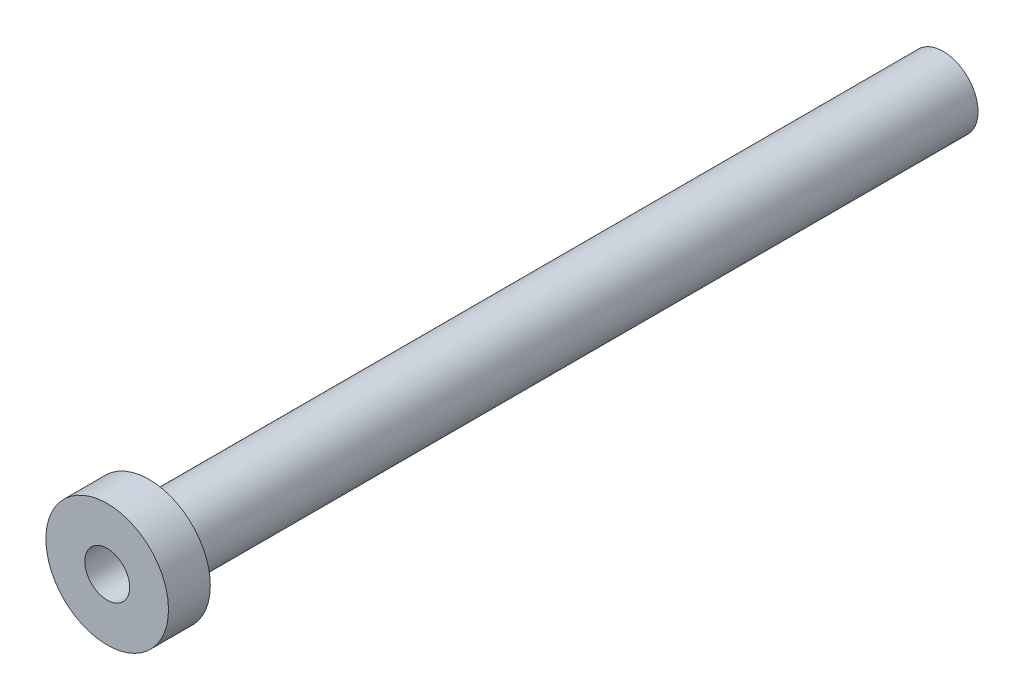
ISO-10303-21;
HEADER;
FILE_DESCRIPTION(('STEP AP214'),'2;1');
FILE_NAME('part.step','',(''),(''),'','','');
FILE_SCHEMA(('AUTOMOTIVE_DESIGN { 1 0 10303 214 1 1 1 1 }'));
ENDSEC;
DATA;
#1=APPLICATION_CONTEXT('core data for automotive mechanical design processes');
#2=APPLICATION_PROTOCOL_DEFINITION('international standard','automotive_design',2000,#1);
#3=PRODUCT_CONTEXT('',#1,'mechanical');
#4=PRODUCT('Part','Part','',(#3));
#5=PRODUCT_RELATED_PRODUCT_CATEGORY('part','',(#4));
#6=PRODUCT_DEFINITION_FORMATION('','',#4);
#7=PRODUCT_DEFINITION_CONTEXT('part definition',#1,'design');
#8=PRODUCT_DEFINITION('design','',#6,#7);
#9=PRODUCT_DEFINITION_SHAPE('','',#8);
#10=(LENGTH_UNIT() NAMED_UNIT(*) SI_UNIT(.MILLI.,.METRE.));
#11=(NAMED_UNIT(*) PLANE_ANGLE_UNIT() SI_UNIT($,.RADIAN.));
#12=(NAMED_UNIT(*) SI_UNIT($,.STERADIAN.) SOLID_ANGLE_UNIT());
#13=UNCERTAINTY_MEASURE_WITH_UNIT(LENGTH_MEASURE(1.E-05),#10,'distance_accuracy_value','');
#14=(GEOMETRIC_REPRESENTATION_CONTEXT(3) GLOBAL_UNCERTAINTY_ASSIGNED_CONTEXT((#13)) GLOBAL_UNIT_ASSIGNED_CONTEXT((#10,
#11,#12)) REPRESENTATION_CONTEXT('',''));
#15=CARTESIAN_POINT('',(0.,0.,0.));
#16=DIRECTION('',(0.,0.,1.));
#17=DIRECTION('',(1.,0.,0.));
#18=AXIS2_PLACEMENT_3D('',#15,#16,#17);
#19=CARTESIAN_POINT('',(0.,0.,15.));
#20=DIRECTION('',(0.,0.,-1.));
#21=DIRECTION('',(-1.,0.,0.));
#22=AXIS2_PLACEMENT_3D('',#19,#20,#21);
#23=CYLINDRICAL_SURFACE('',#22,22.);
#24=CARTESIAN_POINT('',(0.,0.,15.));
#25=DIRECTION('',(0.,0.,1.));
#26=DIRECTION('',(1.,0.,0.));
#27=AXIS2_PLACEMENT_3D('',#24,#25,#26);
#28=CIRCLE('',#27,22.);
#29=CARTESIAN_POINT('',(22.,0.,15.));
#30=VERTEX_POINT('',#29);
#31=EDGE_CURVE('E10',#30,#30,#28,.T.);
#32=ORIENTED_EDGE('',*,*,#31,.F.);
#33=EDGE_LOOP('',(#32));
#34=FACE_BOUND('',#33,.T.);
#35=CARTESIAN_POINT('',(0.,0.,0.));
#36=DIRECTION('',(0.,0.,1.));
#37=DIRECTION('',(1.,0.,0.));
#38=AXIS2_PLACEMENT_3D('',#35,#36,#37);
#39=CIRCLE('',#38,22.);
#40=CARTESIAN_POINT('',(22.,0.,0.));
#41=VERTEX_POINT('',#40);
#42=EDGE_CURVE('E34',#41,#41,#39,.T.);
#43=ORIENTED_EDGE('',*,*,#42,.T.);
#44=EDGE_LOOP('',(#43));
#45=FACE_BOUND('',#44,.T.);
#46=ADVANCED_FACE('F31',(#34,#45),#23,.T.);
#47=CARTESIAN_POINT('',(0.,0.,15.));
#48=DIRECTION('',(0.,0.,1.));
#49=DIRECTION('',(1.,0.,0.));
#50=AXIS2_PLACEMENT_3D('',#47,#48,#49);
#51=PLANE('',#50);
#52=CARTESIAN_POINT('',(0.,0.,15.));
#53=DIRECTION('',(0.,0.,1.));
#54=DIRECTION('',(1.,0.,0.));
#55=AXIS2_PLACEMENT_3D('',#52,#53,#54);
#56=CIRCLE('',#55,8.05);
#57=CARTESIAN_POINT('',(8.05,0.,15.));
#58=VERTEX_POINT('',#57);
#59=EDGE_CURVE('E51',#58,#58,#56,.T.);
#60=ORIENTED_EDGE('',*,*,#59,.F.);
#61=EDGE_LOOP('',(#60));
#62=FACE_BOUND('',#61,.T.);
#63=ORIENTED_EDGE('',*,*,#31,.T.);
#64=EDGE_LOOP('',(#63));
#65=FACE_BOUND('',#64,.T.);
#66=ADVANCED_FACE('F74',(#62,#65),#51,.T.);
#67=CARTESIAN_POINT('',(0.,0.,0.));
#68=DIRECTION('',(0.,0.,1.));
#69=DIRECTION('',(1.,0.,0.));
#70=AXIS2_PLACEMENT_3D('',#67,#68,#69);
#71=PLANE('',#70);
#72=CARTESIAN_POINT('',(0.,0.,0.));
#73=DIRECTION('',(0.,0.,-1.));
#74=DIRECTION('',(-1.,0.,0.));
#75=AXIS2_PLACEMENT_3D('',#72,#73,#74);
#76=CIRCLE('',#75,17.75);
#77=CARTESIAN_POINT('',(-17.75,0.,0.));
#78=VERTEX_POINT('',#77);
#79=EDGE_CURVE('E43',#78,#78,#76,.T.);
#80=ORIENTED_EDGE('',*,*,#79,.F.);
#81=EDGE_LOOP('',(#80));
#82=FACE_BOUND('',#81,.T.);
#83=ORIENTED_EDGE('',*,*,#42,.F.);
#84=EDGE_LOOP('',(#83));
#85=FACE_BOUND('',#84,.T.);
#86=ADVANCED_FACE('F79',(#82,#85),#71,.F.);
#87=CARTESIAN_POINT('',(0.,0.,10.));
#88=DIRECTION('',(0.,0.,-1.));
#89=DIRECTION('',(-1.,0.,0.));
#90=AXIS2_PLACEMENT_3D('',#87,#88,#89);
#91=CYLINDRICAL_SURFACE('',#90,17.75);
#92=CARTESIAN_POINT('',(0.,0.,10.));
#93=DIRECTION('',(0.,0.,-1.));
#94=DIRECTION('',(-1.,0.,0.));
#95=AXIS2_PLACEMENT_3D('',#92,#93,#94);
#96=CIRCLE('',#95,17.75);
#97=CARTESIAN_POINT('',(-17.75,0.,10.));
#98=VERTEX_POINT('',#97);
#99=EDGE_CURVE('E41',#98,#98,#96,.T.);
#100=ORIENTED_EDGE('',*,*,#99,.F.);
#101=EDGE_LOOP('',(#100));
#102=FACE_BOUND('',#101,.T.);
#103=ORIENTED_EDGE('',*,*,#79,.T.);
#104=EDGE_LOOP('',(#103));
#105=FACE_BOUND('',#104,.T.);
#106=ADVANCED_FACE('F86',(#102,#105),#91,.F.);
#107=CARTESIAN_POINT('',(0.,0.,10.));
#108=DIRECTION('',(0.,0.,-1.));
#109=DIRECTION('',(-1.,0.,0.));
#110=AXIS2_PLACEMENT_3D('',#107,#108,#109);
#111=PLANE('',#110);
#112=CARTESIAN_POINT('',(0.,0.,10.));
#113=DIRECTION('',(0.,0.,-1.));
#114=DIRECTION('',(-1.,0.,0.));
#115=AXIS2_PLACEMENT_3D('',#112,#113,#114);
#116=CIRCLE('',#115,12.5);
#117=CARTESIAN_POINT('',(-12.5,0.,10.));
#118=VERTEX_POINT('',#117);
#119=EDGE_CURVE('E46',#118,#118,#116,.T.);
#120=ORIENTED_EDGE('',*,*,#119,.F.);
#121=EDGE_LOOP('',(#120));
#122=FACE_BOUND('',#121,.T.);
#123=ORIENTED_EDGE('',*,*,#99,.T.);
#124=EDGE_LOOP('',(#123));
#125=FACE_BOUND('',#124,.T.);
#126=ADVANCED_FACE('F91',(#122,#125),#111,.T.);
#127=CARTESIAN_POINT('',(0.,0.,10.));
#128=DIRECTION('',(0.,0.,-1.));
#129=DIRECTION('',(-1.,0.,0.));
#130=AXIS2_PLACEMENT_3D('',#127,#128,#129);
#131=CYLINDRICAL_SURFACE('',#130,12.5);
#132=ORIENTED_EDGE('',*,*,#119,.T.);
#133=EDGE_LOOP('',(#132));
#134=FACE_BOUND('',#133,.T.);
#135=CARTESIAN_POINT('',(0.,0.,-285.));
#136=DIRECTION('',(0.,0.,-1.));
#137=DIRECTION('',(-1.,0.,0.));
#138=AXIS2_PLACEMENT_3D('',#135,#136,#137);
#139=CIRCLE('',#138,12.5);
#140=CARTESIAN_POINT('',(-12.5,0.,-285.));
#141=VERTEX_POINT('',#140);
#142=EDGE_CURVE('E54',#141,#141,#139,.T.);
#143=ORIENTED_EDGE('',*,*,#142,.F.);
#144=EDGE_LOOP('',(#143));
#145=FACE_BOUND('',#144,.T.);
#146=ADVANCED_FACE('F70',(#134,#145),#131,.T.);
#147=CARTESIAN_POINT('',(0.,0.,0.));
#148=DIRECTION('',(0.,0.,1.));
#149=DIRECTION('',(1.,0.,0.));
#150=AXIS2_PLACEMENT_3D('',#147,#148,#149);
#151=CYLINDRICAL_SURFACE('',#150,8.05);
#152=ORIENTED_EDGE('',*,*,#59,.T.);
#153=EDGE_LOOP('',(#152));
#154=FACE_BOUND('',#153,.T.);
#155=CARTESIAN_POINT('',(0.,0.,-285.));
#156=DIRECTION('',(0.,0.,-1.));
#157=DIRECTION('',(-1.,0.,0.));
#158=AXIS2_PLACEMENT_3D('',#155,#156,#157);
#159=CIRCLE('',#158,8.05);
#160=CARTESIAN_POINT('',(-8.05,0.,-285.));
#161=VERTEX_POINT('',#160);
#162=EDGE_CURVE('E57',#161,#161,#159,.T.);
#163=ORIENTED_EDGE('',*,*,#162,.T.);
#164=EDGE_LOOP('',(#163));
#165=FACE_BOUND('',#164,.T.);
#166=ADVANCED_FACE('F61',(#154,#165),#151,.F.);
#167=CARTESIAN_POINT('',(0.,0.,-285.));
#168=DIRECTION('',(0.,0.,-1.));
#169=DIRECTION('',(-1.,0.,0.));
#170=AXIS2_PLACEMENT_3D('',#167,#168,#169);
#171=PLANE('',#170);
#172=ORIENTED_EDGE('',*,*,#142,.T.);
#173=EDGE_LOOP('',(#172));
#174=FACE_BOUND('',#173,.T.);
#175=ORIENTED_EDGE('',*,*,#162,.F.);
#176=EDGE_LOOP('',(#175));
#177=FACE_BOUND('',#176,.T.);
#178=ADVANCED_FACE('F63',(#174,#177),#171,.T.);
#179=CLOSED_SHELL('',(#46,#66,#86,#106,#126,#146,#166,#178));
#180=MANIFOLD_SOLID_BREP('B2',#179);
#181=ADVANCED_BREP_SHAPE_REPRESENTATION('',(#18,#180),#14);
#182=SHAPE_DEFINITION_REPRESENTATION(#9,#181);
ENDSEC;
END-ISO-10303-21;
